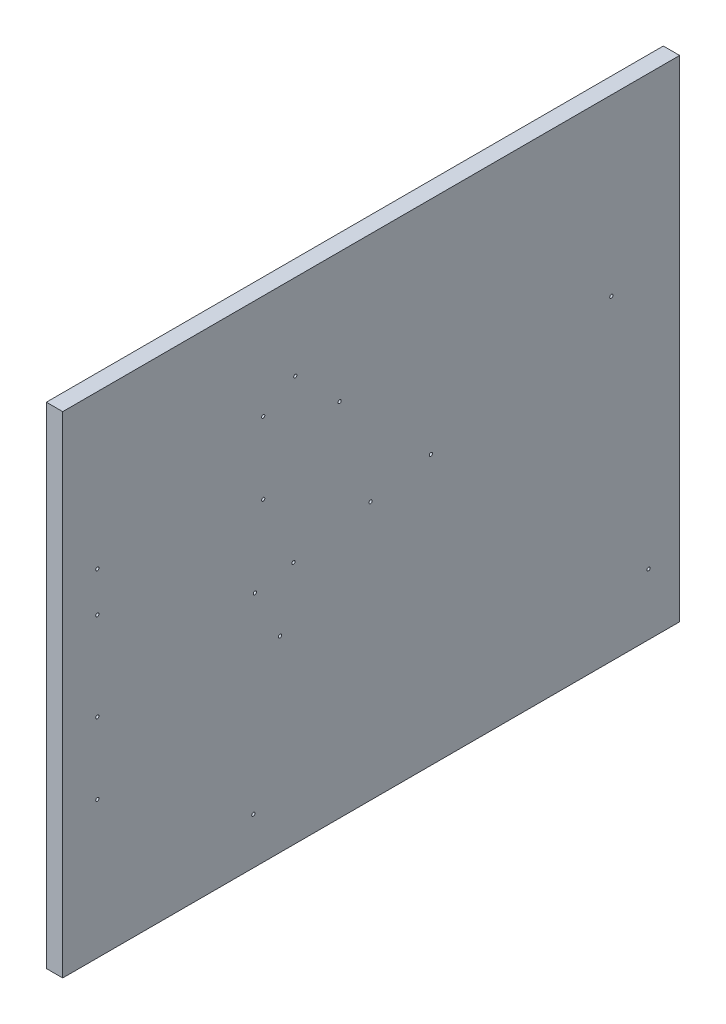
ISO-10303-21;
HEADER;
FILE_DESCRIPTION(('STEP AP214'),'2;1');
FILE_NAME('part.step','',(''),(''),'','','');
FILE_SCHEMA(('AUTOMOTIVE_DESIGN { 1 0 10303 214 1 1 1 1 }'));
ENDSEC;
DATA;
#1=APPLICATION_CONTEXT('core data for automotive mechanical design processes');
#2=APPLICATION_PROTOCOL_DEFINITION('international standard','automotive_design',2000,#1);
#3=PRODUCT_CONTEXT('',#1,'mechanical');
#4=PRODUCT('Part','Part','',(#3));
#5=PRODUCT_RELATED_PRODUCT_CATEGORY('part','',(#4));
#6=PRODUCT_DEFINITION_FORMATION('','',#4);
#7=PRODUCT_DEFINITION_CONTEXT('part definition',#1,'design');
#8=PRODUCT_DEFINITION('design','',#6,#7);
#9=PRODUCT_DEFINITION_SHAPE('','',#8);
#10=(LENGTH_UNIT() NAMED_UNIT(*) SI_UNIT(.MILLI.,.METRE.));
#11=(NAMED_UNIT(*) PLANE_ANGLE_UNIT() SI_UNIT($,.RADIAN.));
#12=(NAMED_UNIT(*) SI_UNIT($,.STERADIAN.) SOLID_ANGLE_UNIT());
#13=UNCERTAINTY_MEASURE_WITH_UNIT(LENGTH_MEASURE(1.E-05),#10,'distance_accuracy_value','');
#14=(GEOMETRIC_REPRESENTATION_CONTEXT(3) GLOBAL_UNCERTAINTY_ASSIGNED_CONTEXT((#13)) GLOBAL_UNIT_ASSIGNED_CONTEXT((#10,
#11,#12)) REPRESENTATION_CONTEXT('',''));
#15=CARTESIAN_POINT('',(0.,0.,0.));
#16=DIRECTION('',(0.,0.,1.));
#17=DIRECTION('',(1.,0.,0.));
#18=AXIS2_PLACEMENT_3D('',#15,#16,#17);
#19=CARTESIAN_POINT('',(15.,423.716182749274,74.5220709406169));
#20=DIRECTION('',(0.,0.,-1.));
#21=DIRECTION('',(0.,1.,0.));
#22=AXIS2_PLACEMENT_3D('',#19,#20,#21);
#23=PLANE('',#22);
#24=DIRECTION('',(0.,-1.,0.));
#25=VECTOR('',#24,1.);
#26=CARTESIAN_POINT('',(0.,423.716182749274,74.5220709406169));
#27=LINE('',#26,#25);
#28=CARTESIAN_POINT('',(0.,423.716182749274,74.5220709406169));
#29=VERTEX_POINT('',#28);
#30=CARTESIAN_POINT('',(0.,-26.2838172507259,74.5220709406169));
#31=VERTEX_POINT('',#30);
#32=EDGE_CURVE('E101',#29,#31,#27,.T.);
#33=ORIENTED_EDGE('',*,*,#32,.T.);
#34=DIRECTION('',(-1.,0.,0.));
#35=VECTOR('',#34,1.);
#36=CARTESIAN_POINT('',(15.,-26.2838172507259,74.5220709406169));
#37=LINE('',#36,#35);
#38=CARTESIAN_POINT('',(15.,-26.2838172507259,74.5220709406169));
#39=VERTEX_POINT('',#38);
#40=EDGE_CURVE('E11',#39,#31,#37,.T.);
#41=ORIENTED_EDGE('',*,*,#40,.F.);
#42=DIRECTION('',(0.,-1.,0.));
#43=VECTOR('',#42,1.);
#44=CARTESIAN_POINT('',(15.,423.716182749274,74.5220709406169));
#45=LINE('',#44,#43);
#46=CARTESIAN_POINT('',(15.,423.716182749274,74.5220709406169));
#47=VERTEX_POINT('',#46);
#48=EDGE_CURVE('E88',#47,#39,#45,.T.);
#49=ORIENTED_EDGE('',*,*,#48,.F.);
#50=DIRECTION('',(-1.,0.,0.));
#51=VECTOR('',#50,1.);
#52=CARTESIAN_POINT('',(15.,423.716182749274,74.5220709406169));
#53=LINE('',#52,#51);
#54=EDGE_CURVE('E97',#47,#29,#53,.T.);
#55=ORIENTED_EDGE('',*,*,#54,.T.);
#56=EDGE_LOOP('',(#33,#41,#49,#55));
#57=FACE_BOUND('',#56,.T.);
#58=ADVANCED_FACE('F35',(#57),#23,.F.);
#59=CARTESIAN_POINT('',(15.,-26.2838172507259,74.5220709406169));
#60=DIRECTION('',(0.,1.,0.));
#61=DIRECTION('',(0.,0.,1.));
#62=AXIS2_PLACEMENT_3D('',#59,#60,#61);
#63=PLANE('',#62);
#64=DIRECTION('',(0.,0.,-1.));
#65=VECTOR('',#64,1.);
#66=CARTESIAN_POINT('',(0.,-26.2838172507259,74.5220709406169));
#67=LINE('',#66,#65);
#68=CARTESIAN_POINT('',(0.,-26.2838172507287,-491.483230018847));
#69=VERTEX_POINT('',#68);
#70=EDGE_CURVE('E92',#31,#69,#67,.T.);
#71=ORIENTED_EDGE('',*,*,#70,.T.);
#72=DIRECTION('',(-1.,0.,0.));
#73=VECTOR('',#72,1.);
#74=CARTESIAN_POINT('',(15.,-26.2838172507287,-491.483230018847));
#75=LINE('',#74,#73);
#76=CARTESIAN_POINT('',(15.,-26.2838172507287,-491.483230018847));
#77=VERTEX_POINT('',#76);
#78=EDGE_CURVE('E44',#77,#69,#75,.T.);
#79=ORIENTED_EDGE('',*,*,#78,.F.);
#80=DIRECTION('',(0.,0.,-1.));
#81=VECTOR('',#80,1.);
#82=CARTESIAN_POINT('',(15.,-26.2838172507259,74.5220709406169));
#83=LINE('',#82,#81);
#84=EDGE_CURVE('E83',#39,#77,#83,.T.);
#85=ORIENTED_EDGE('',*,*,#84,.F.);
#86=ORIENTED_EDGE('',*,*,#40,.T.);
#87=EDGE_LOOP('',(#71,#79,#85,#86));
#88=FACE_BOUND('',#87,.T.);
#89=ADVANCED_FACE('F91',(#88),#63,.F.);
#90=CARTESIAN_POINT('',(15.,423.716182749271,-491.483230018847));
#91=DIRECTION('',(0.,0.,1.));
#92=DIRECTION('',(0.,-1.,0.));
#93=AXIS2_PLACEMENT_3D('',#90,#91,#92);
#94=PLANE('',#93);
#95=DIRECTION('',(0.,1.,0.));
#96=VECTOR('',#95,1.);
#97=CARTESIAN_POINT('',(0.,423.716182749271,-491.483230018847));
#98=LINE('',#97,#96);
#99=CARTESIAN_POINT('',(0.,423.716182749271,-491.483230018847));
#100=VERTEX_POINT('',#99);
#101=EDGE_CURVE('E70',#69,#100,#98,.T.);
#102=ORIENTED_EDGE('',*,*,#101,.T.);
#103=DIRECTION('',(-1.,0.,0.));
#104=VECTOR('',#103,1.);
#105=CARTESIAN_POINT('',(15.,423.716182749271,-491.483230018847));
#106=LINE('',#105,#104);
#107=CARTESIAN_POINT('',(15.,423.716182749271,-491.483230018847));
#108=VERTEX_POINT('',#107);
#109=EDGE_CURVE('E93',#108,#100,#106,.T.);
#110=ORIENTED_EDGE('',*,*,#109,.F.);
#111=DIRECTION('',(0.,1.,0.));
#112=VECTOR('',#111,1.);
#113=CARTESIAN_POINT('',(15.,423.716182749271,-491.483230018847));
#114=LINE('',#113,#112);
#115=EDGE_CURVE('E86',#77,#108,#114,.T.);
#116=ORIENTED_EDGE('',*,*,#115,.F.);
#117=ORIENTED_EDGE('',*,*,#78,.T.);
#118=EDGE_LOOP('',(#102,#110,#116,#117));
#119=FACE_BOUND('',#118,.T.);
#120=ADVANCED_FACE('F95',(#119),#94,.F.);
#121=CARTESIAN_POINT('',(15.,423.716182749274,74.5220709406169));
#122=DIRECTION('',(0.,-1.,0.));
#123=DIRECTION('',(0.,0.,-1.));
#124=AXIS2_PLACEMENT_3D('',#121,#122,#123);
#125=PLANE('',#124);
#126=DIRECTION('',(0.,0.,1.));
#127=VECTOR('',#126,1.);
#128=CARTESIAN_POINT('',(0.,423.716182749274,74.5220709406169));
#129=LINE('',#128,#127);
#130=EDGE_CURVE('E76',#100,#29,#129,.T.);
#131=ORIENTED_EDGE('',*,*,#130,.T.);
#132=ORIENTED_EDGE('',*,*,#54,.F.);
#133=DIRECTION('',(0.,0.,1.));
#134=VECTOR('',#133,1.);
#135=CARTESIAN_POINT('',(15.,423.716182749274,74.5220709406169));
#136=LINE('',#135,#134);
#137=EDGE_CURVE('E53',#108,#47,#136,.T.);
#138=ORIENTED_EDGE('',*,*,#137,.F.);
#139=ORIENTED_EDGE('',*,*,#109,.T.);
#140=EDGE_LOOP('',(#131,#132,#138,#139));
#141=FACE_BOUND('',#140,.T.);
#142=ADVANCED_FACE('F182',(#141),#125,.F.);
#143=CARTESIAN_POINT('',(15.,0.,0.));
#144=DIRECTION('',(1.,0.,0.));
#145=DIRECTION('',(0.,0.,-1.));
#146=AXIS2_PLACEMENT_3D('',#143,#144,#145);
#147=PLANE('',#146);
#148=CARTESIAN_POINT('',(15.,263.704028896328,-428.821301923143));
#149=DIRECTION('',(-1.,0.,0.));
#150=DIRECTION('',(0.,0.,1.));
#151=AXIS2_PLACEMENT_3D('',#148,#149,#150);
#152=CIRCLE('',#151,1.50000000000002);
#153=CARTESIAN_POINT('',(15.,263.704028896328,-427.321301923143));
#154=VERTEX_POINT('',#153);
#155=EDGE_CURVE('E404',#154,#154,#152,.T.);
#156=ORIENTED_EDGE('',*,*,#155,.T.);
#157=EDGE_LOOP('',(#156));
#158=FACE_BOUND('',#157,.T.);
#159=CARTESIAN_POINT('',(15.,262.061630052592,-109.444727656964));
#160=DIRECTION('',(-1.,0.,0.));
#161=DIRECTION('',(0.,0.,1.));
#162=AXIS2_PLACEMENT_3D('',#159,#160,#161);
#163=CIRCLE('',#162,1.5);
#164=CARTESIAN_POINT('',(15.,262.061630052592,-107.944727656964));
#165=VERTEX_POINT('',#164);
#166=EDGE_CURVE('E406',#165,#165,#163,.T.);
#167=ORIENTED_EDGE('',*,*,#166,.T.);
#168=EDGE_LOOP('',(#167));
#169=FACE_BOUND('',#168,.T.);
#170=CARTESIAN_POINT('',(15.,327.974766947683,-109.444727656964));
#171=DIRECTION('',(-1.,0.,0.));
#172=DIRECTION('',(0.,0.,1.));
#173=AXIS2_PLACEMENT_3D('',#170,#171,#172);
#174=CIRCLE('',#173,1.5);
#175=CARTESIAN_POINT('',(15.,327.974766947683,-107.944727656964));
#176=VERTEX_POINT('',#175);
#177=EDGE_CURVE('E412',#176,#176,#174,.T.);
#178=ORIENTED_EDGE('',*,*,#177,.T.);
#179=EDGE_LOOP('',(#178));
#180=FACE_BOUND('',#179,.T.);
#181=CARTESIAN_POINT('',(15.,29.9660510812131,-463.012887704361));
#182=DIRECTION('',(-1.,0.,0.));
#183=DIRECTION('',(0.,0.,1.));
#184=AXIS2_PLACEMENT_3D('',#181,#182,#183);
#185=CIRCLE('',#184,1.50000000000177);
#186=CARTESIAN_POINT('',(15.,29.9660510812131,-461.512887704359));
#187=VERTEX_POINT('',#186);
#188=EDGE_CURVE('E415',#187,#187,#185,.T.);
#189=ORIENTED_EDGE('',*,*,#188,.T.);
#190=EDGE_LOOP('',(#189));
#191=FACE_BOUND('',#190,.T.);
#192=CARTESIAN_POINT('',(15.,282.872517244577,42.7146520525029));
#193=DIRECTION('',(-1.,0.,0.));
#194=DIRECTION('',(0.,0.,1.));
#195=AXIS2_PLACEMENT_3D('',#192,#193,#194);
#196=CIRCLE('',#195,1.5);
#197=CARTESIAN_POINT('',(15.,282.872517244577,44.2146520525029));
#198=VERTEX_POINT('',#197);
#199=EDGE_CURVE('E405',#198,#198,#196,.T.);
#200=ORIENTED_EDGE('',*,*,#199,.T.);
#201=EDGE_LOOP('',(#200));
#202=FACE_BOUND('',#201,.T.);
#203=CARTESIAN_POINT('',(15.,246.301380308381,42.7146520525029));
#204=DIRECTION('',(-1.,0.,0.));
#205=DIRECTION('',(0.,0.,1.));
#206=AXIS2_PLACEMENT_3D('',#203,#204,#205);
#207=CIRCLE('',#206,1.5);
#208=CARTESIAN_POINT('',(15.,246.301380308381,44.2146520525029));
#209=VERTEX_POINT('',#208);
#210=EDGE_CURVE('E409',#209,#209,#207,.T.);
#211=ORIENTED_EDGE('',*,*,#210,.T.);
#212=EDGE_LOOP('',(#211));
#213=FACE_BOUND('',#212,.T.);
#214=CARTESIAN_POINT('',(15.,191.557326368785,-101.789718427287));
#215=DIRECTION('',(-1.,0.,0.));
#216=DIRECTION('',(0.,0.,1.));
#217=AXIS2_PLACEMENT_3D('',#214,#215,#216);
#218=CIRCLE('',#217,1.5);
#219=CARTESIAN_POINT('',(15.,191.557326368785,-100.289718427287));
#220=VERTEX_POINT('',#219);
#221=EDGE_CURVE('E440',#220,#220,#218,.T.);
#222=ORIENTED_EDGE('',*,*,#221,.T.);
#223=EDGE_LOOP('',(#222));
#224=FACE_BOUND('',#223,.T.);
#225=CARTESIAN_POINT('',(15.,16.3607927560594,-100.410954005248));
#226=DIRECTION('',(-1.,0.,0.));
#227=DIRECTION('',(0.,0.,1.));
#228=AXIS2_PLACEMENT_3D('',#225,#226,#227);
#229=CIRCLE('',#228,1.5);
#230=CARTESIAN_POINT('',(15.,16.3607927560594,-98.9109540052479));
#231=VERTEX_POINT('',#230);
#232=EDGE_CURVE('E436',#231,#231,#229,.T.);
#233=ORIENTED_EDGE('',*,*,#232,.T.);
#234=EDGE_LOOP('',(#233));
#235=FACE_BOUND('',#234,.T.);
#236=CARTESIAN_POINT('',(15.,99.6926212042853,42.7146520525029));
#237=DIRECTION('',(-1.,0.,0.));
#238=DIRECTION('',(0.,0.,1.));
#239=AXIS2_PLACEMENT_3D('',#236,#237,#238);
#240=CIRCLE('',#239,1.5);
#241=CARTESIAN_POINT('',(15.,99.6926212042853,44.2146520525029));
#242=VERTEX_POINT('',#241);
#243=EDGE_CURVE('E167',#242,#242,#240,.T.);
#244=ORIENTED_EDGE('',*,*,#243,.T.);
#245=EDGE_LOOP('',(#244));
#246=FACE_BOUND('',#245,.T.);
#247=CARTESIAN_POINT('',(15.,145.715565594254,-124.831154963935));
#248=DIRECTION('',(-1.,0.,0.));
#249=DIRECTION('',(0.,0.,1.));
#250=AXIS2_PLACEMENT_3D('',#247,#248,#249);
#251=CIRCLE('',#250,1.5);
#252=CARTESIAN_POINT('',(15.,145.715565594254,-123.331154963935));
#253=VERTEX_POINT('',#252);
#254=EDGE_CURVE('E431',#253,#253,#251,.T.);
#255=ORIENTED_EDGE('',*,*,#254,.T.);
#256=EDGE_LOOP('',(#255));
#257=FACE_BOUND('',#256,.T.);
#258=CARTESIAN_POINT('',(15.,165.278795224128,42.7146520525029));
#259=DIRECTION('',(-1.,0.,0.));
#260=DIRECTION('',(0.,0.,1.));
#261=AXIS2_PLACEMENT_3D('',#258,#259,#260);
#262=CIRCLE('',#261,1.5);
#263=CARTESIAN_POINT('',(15.,165.278795224128,44.2146520525029));
#264=VERTEX_POINT('',#263);
#265=EDGE_CURVE('E429',#264,#264,#262,.T.);
#266=ORIENTED_EDGE('',*,*,#265,.T.);
#267=EDGE_LOOP('',(#266));
#268=FACE_BOUND('',#267,.T.);
#269=CARTESIAN_POINT('',(15.,197.982216734422,-137.119879484511));
#270=DIRECTION('',(-1.,0.,0.));
#271=DIRECTION('',(0.,0.,1.));
#272=AXIS2_PLACEMENT_3D('',#269,#270,#271);
#273=CIRCLE('',#272,1.5);
#274=CARTESIAN_POINT('',(15.,197.982216734422,-135.619879484511));
#275=VERTEX_POINT('',#274);
#276=EDGE_CURVE('E426',#275,#275,#273,.T.);
#277=ORIENTED_EDGE('',*,*,#276,.T.);
#278=EDGE_LOOP('',(#277));
#279=FACE_BOUND('',#278,.T.);
#280=CARTESIAN_POINT('',(15.,210.859443584632,-207.931126478173));
#281=DIRECTION('',(-1.,0.,0.));
#282=DIRECTION('',(0.,0.,1.));
#283=AXIS2_PLACEMENT_3D('',#280,#281,#282);
#284=CIRCLE('',#283,1.5);
#285=CARTESIAN_POINT('',(15.,210.859443584632,-206.431126478173));
#286=VERTEX_POINT('',#285);
#287=EDGE_CURVE('E423',#286,#286,#284,.T.);
#288=ORIENTED_EDGE('',*,*,#287,.T.);
#289=EDGE_LOOP('',(#288));
#290=FACE_BOUND('',#289,.T.);
#291=CARTESIAN_POINT('',(15.,220.869392182557,-263.276124199719));
#292=DIRECTION('',(-1.,0.,0.));
#293=DIRECTION('',(0.,0.,1.));
#294=AXIS2_PLACEMENT_3D('',#291,#292,#293);
#295=CIRCLE('',#294,1.49999999998557);
#296=CARTESIAN_POINT('',(15.,220.869392182557,-261.776124199733));
#297=VERTEX_POINT('',#296);
#298=EDGE_CURVE('E420',#297,#297,#295,.T.);
#299=ORIENTED_EDGE('',*,*,#298,.T.);
#300=EDGE_LOOP('',(#299));
#301=FACE_BOUND('',#300,.T.);
#302=CARTESIAN_POINT('',(15.,304.649886729785,-179.495629652479));
#303=DIRECTION('',(-1.,0.,0.));
#304=DIRECTION('',(0.,0.,1.));
#305=AXIS2_PLACEMENT_3D('',#302,#303,#304);
#306=CIRCLE('',#305,1.49999999999977);
#307=CARTESIAN_POINT('',(15.,304.649886729785,-177.995629652479));
#308=VERTEX_POINT('',#307);
#309=EDGE_CURVE('E119',#308,#308,#306,.T.);
#310=ORIENTED_EDGE('',*,*,#309,.T.);
#311=EDGE_LOOP('',(#310));
#312=FACE_BOUND('',#311,.T.);
#313=CARTESIAN_POINT('',(15.,345.23563332764,-138.909883054618));
#314=DIRECTION('',(-1.,0.,0.));
#315=DIRECTION('',(0.,0.,1.));
#316=AXIS2_PLACEMENT_3D('',#313,#314,#315);
#317=CIRCLE('',#316,1.49999999999983);
#318=CARTESIAN_POINT('',(15.,345.23563332764,-137.409883054618));
#319=VERTEX_POINT('',#318);
#320=EDGE_CURVE('E114',#319,#319,#317,.T.);
#321=ORIENTED_EDGE('',*,*,#320,.T.);
#322=EDGE_LOOP('',(#321));
#323=FACE_BOUND('',#322,.T.);
#324=ORIENTED_EDGE('',*,*,#48,.T.);
#325=ORIENTED_EDGE('',*,*,#84,.T.);
#326=ORIENTED_EDGE('',*,*,#115,.T.);
#327=ORIENTED_EDGE('',*,*,#137,.T.);
#328=EDGE_LOOP('',(#324,#325,#326,#327));
#329=FACE_BOUND('',#328,.T.);
#330=ADVANCED_FACE('F84',(#158,#169,#180,#191,#202,#213,#224,#235,#246,#257,#268,#279,#290,#301,
#312,#323,#329),#147,.T.);
#331=CARTESIAN_POINT('',(0.,0.,0.));
#332=DIRECTION('',(1.,0.,0.));
#333=DIRECTION('',(0.,0.,-1.));
#334=AXIS2_PLACEMENT_3D('',#331,#332,#333);
#335=PLANE('',#334);
#336=CARTESIAN_POINT('',(0.,263.704028896328,-428.821301923143));
#337=DIRECTION('',(1.,0.,0.));
#338=DIRECTION('',(0.,0.,-1.));
#339=AXIS2_PLACEMENT_3D('',#336,#337,#338);
#340=CIRCLE('',#339,1.50000000000002);
#341=CARTESIAN_POINT('',(0.,263.704028896328,-430.321301923143));
#342=VERTEX_POINT('',#341);
#343=EDGE_CURVE('E38',#342,#342,#340,.T.);
#344=ORIENTED_EDGE('',*,*,#343,.T.);
#345=EDGE_LOOP('',(#344));
#346=FACE_BOUND('',#345,.T.);
#347=CARTESIAN_POINT('',(0.,262.061630052592,-109.444727656964));
#348=DIRECTION('',(1.,0.,0.));
#349=DIRECTION('',(0.,0.,-1.));
#350=AXIS2_PLACEMENT_3D('',#347,#348,#349);
#351=CIRCLE('',#350,1.5);
#352=CARTESIAN_POINT('',(0.,262.061630052592,-110.944727656964));
#353=VERTEX_POINT('',#352);
#354=EDGE_CURVE('E154',#353,#353,#351,.T.);
#355=ORIENTED_EDGE('',*,*,#354,.T.);
#356=EDGE_LOOP('',(#355));
#357=FACE_BOUND('',#356,.T.);
#358=CARTESIAN_POINT('',(0.,327.974766947683,-109.444727656964));
#359=DIRECTION('',(1.,0.,0.));
#360=DIRECTION('',(0.,0.,-1.));
#361=AXIS2_PLACEMENT_3D('',#358,#359,#360);
#362=CIRCLE('',#361,1.5);
#363=CARTESIAN_POINT('',(0.,327.974766947683,-110.944727656964));
#364=VERTEX_POINT('',#363);
#365=EDGE_CURVE('E152',#364,#364,#362,.T.);
#366=ORIENTED_EDGE('',*,*,#365,.T.);
#367=EDGE_LOOP('',(#366));
#368=FACE_BOUND('',#367,.T.);
#369=CARTESIAN_POINT('',(0.,29.9660510812131,-463.012887704361));
#370=DIRECTION('',(1.,0.,0.));
#371=DIRECTION('',(0.,0.,-1.));
#372=AXIS2_PLACEMENT_3D('',#369,#370,#371);
#373=CIRCLE('',#372,1.50000000000177);
#374=CARTESIAN_POINT('',(0.,29.9660510812131,-464.512887704363));
#375=VERTEX_POINT('',#374);
#376=EDGE_CURVE('E149',#375,#375,#373,.T.);
#377=ORIENTED_EDGE('',*,*,#376,.T.);
#378=EDGE_LOOP('',(#377));
#379=FACE_BOUND('',#378,.T.);
#380=CARTESIAN_POINT('',(0.,282.872517244577,42.7146520525029));
#381=DIRECTION('',(1.,0.,0.));
#382=DIRECTION('',(0.,0.,-1.));
#383=AXIS2_PLACEMENT_3D('',#380,#381,#382);
#384=CIRCLE('',#383,1.5);
#385=CARTESIAN_POINT('',(0.,282.872517244577,41.2146520525029));
#386=VERTEX_POINT('',#385);
#387=EDGE_CURVE('E146',#386,#386,#384,.T.);
#388=ORIENTED_EDGE('',*,*,#387,.T.);
#389=EDGE_LOOP('',(#388));
#390=FACE_BOUND('',#389,.T.);
#391=CARTESIAN_POINT('',(0.,246.301380308381,42.7146520525029));
#392=DIRECTION('',(1.,0.,0.));
#393=DIRECTION('',(0.,0.,-1.));
#394=AXIS2_PLACEMENT_3D('',#391,#392,#393);
#395=CIRCLE('',#394,1.5);
#396=CARTESIAN_POINT('',(0.,246.301380308381,41.2146520525029));
#397=VERTEX_POINT('',#396);
#398=EDGE_CURVE('E143',#397,#397,#395,.T.);
#399=ORIENTED_EDGE('',*,*,#398,.T.);
#400=EDGE_LOOP('',(#399));
#401=FACE_BOUND('',#400,.T.);
#402=CARTESIAN_POINT('',(0.,191.557326368785,-101.789718427287));
#403=DIRECTION('',(1.,0.,0.));
#404=DIRECTION('',(0.,0.,-1.));
#405=AXIS2_PLACEMENT_3D('',#402,#403,#404);
#406=CIRCLE('',#405,1.5);
#407=CARTESIAN_POINT('',(0.,191.557326368785,-103.289718427287));
#408=VERTEX_POINT('',#407);
#409=EDGE_CURVE('E140',#408,#408,#406,.T.);
#410=ORIENTED_EDGE('',*,*,#409,.T.);
#411=EDGE_LOOP('',(#410));
#412=FACE_BOUND('',#411,.T.);
#413=CARTESIAN_POINT('',(0.,16.3607927560594,-100.410954005248));
#414=DIRECTION('',(1.,0.,0.));
#415=DIRECTION('',(0.,0.,-1.));
#416=AXIS2_PLACEMENT_3D('',#413,#414,#415);
#417=CIRCLE('',#416,1.5);
#418=CARTESIAN_POINT('',(0.,16.3607927560594,-101.910954005248));
#419=VERTEX_POINT('',#418);
#420=EDGE_CURVE('E137',#419,#419,#417,.T.);
#421=ORIENTED_EDGE('',*,*,#420,.T.);
#422=EDGE_LOOP('',(#421));
#423=FACE_BOUND('',#422,.T.);
#424=CARTESIAN_POINT('',(0.,99.6926212042853,42.7146520525029));
#425=DIRECTION('',(1.,0.,0.));
#426=DIRECTION('',(0.,0.,-1.));
#427=AXIS2_PLACEMENT_3D('',#424,#425,#426);
#428=CIRCLE('',#427,1.5);
#429=CARTESIAN_POINT('',(0.,99.6926212042853,41.2146520525029));
#430=VERTEX_POINT('',#429);
#431=EDGE_CURVE('E134',#430,#430,#428,.T.);
#432=ORIENTED_EDGE('',*,*,#431,.T.);
#433=EDGE_LOOP('',(#432));
#434=FACE_BOUND('',#433,.T.);
#435=CARTESIAN_POINT('',(0.,145.715565594254,-124.831154963935));
#436=DIRECTION('',(1.,0.,0.));
#437=DIRECTION('',(0.,0.,-1.));
#438=AXIS2_PLACEMENT_3D('',#435,#436,#437);
#439=CIRCLE('',#438,1.5);
#440=CARTESIAN_POINT('',(0.,145.715565594254,-126.331154963935));
#441=VERTEX_POINT('',#440);
#442=EDGE_CURVE('E131',#441,#441,#439,.T.);
#443=ORIENTED_EDGE('',*,*,#442,.T.);
#444=EDGE_LOOP('',(#443));
#445=FACE_BOUND('',#444,.T.);
#446=CARTESIAN_POINT('',(0.,165.278795224128,42.7146520525029));
#447=DIRECTION('',(1.,0.,0.));
#448=DIRECTION('',(0.,0.,-1.));
#449=AXIS2_PLACEMENT_3D('',#446,#447,#448);
#450=CIRCLE('',#449,1.5);
#451=CARTESIAN_POINT('',(0.,165.278795224128,41.2146520525029));
#452=VERTEX_POINT('',#451);
#453=EDGE_CURVE('E128',#452,#452,#450,.T.);
#454=ORIENTED_EDGE('',*,*,#453,.T.);
#455=EDGE_LOOP('',(#454));
#456=FACE_BOUND('',#455,.T.);
#457=CARTESIAN_POINT('',(0.,197.982216734422,-137.119879484511));
#458=DIRECTION('',(1.,0.,0.));
#459=DIRECTION('',(0.,0.,-1.));
#460=AXIS2_PLACEMENT_3D('',#457,#458,#459);
#461=CIRCLE('',#460,1.5);
#462=CARTESIAN_POINT('',(0.,197.982216734422,-138.619879484511));
#463=VERTEX_POINT('',#462);
#464=EDGE_CURVE('E125',#463,#463,#461,.T.);
#465=ORIENTED_EDGE('',*,*,#464,.T.);
#466=EDGE_LOOP('',(#465));
#467=FACE_BOUND('',#466,.T.);
#468=CARTESIAN_POINT('',(0.,210.859443584632,-207.931126478173));
#469=DIRECTION('',(1.,0.,0.));
#470=DIRECTION('',(0.,0.,-1.));
#471=AXIS2_PLACEMENT_3D('',#468,#469,#470);
#472=CIRCLE('',#471,1.5);
#473=CARTESIAN_POINT('',(0.,210.859443584632,-209.431126478173));
#474=VERTEX_POINT('',#473);
#475=EDGE_CURVE('E122',#474,#474,#472,.T.);
#476=ORIENTED_EDGE('',*,*,#475,.T.);
#477=EDGE_LOOP('',(#476));
#478=FACE_BOUND('',#477,.T.);
#479=CARTESIAN_POINT('',(0.,220.869392182557,-263.276124199719));
#480=DIRECTION('',(1.,0.,0.));
#481=DIRECTION('',(0.,0.,-1.));
#482=AXIS2_PLACEMENT_3D('',#479,#480,#481);
#483=CIRCLE('',#482,1.49999999998557);
#484=CARTESIAN_POINT('',(0.,220.869392182557,-264.776124199704));
#485=VERTEX_POINT('',#484);
#486=EDGE_CURVE('E118',#485,#485,#483,.T.);
#487=ORIENTED_EDGE('',*,*,#486,.T.);
#488=EDGE_LOOP('',(#487));
#489=FACE_BOUND('',#488,.T.);
#490=CARTESIAN_POINT('',(0.,304.649886729785,-179.495629652479));
#491=DIRECTION('',(1.,0.,0.));
#492=DIRECTION('',(0.,0.,-1.));
#493=AXIS2_PLACEMENT_3D('',#490,#491,#492);
#494=CIRCLE('',#493,1.49999999999977);
#495=CARTESIAN_POINT('',(0.,304.649886729785,-180.995629652478));
#496=VERTEX_POINT('',#495);
#497=EDGE_CURVE('E115',#496,#496,#494,.T.);
#498=ORIENTED_EDGE('',*,*,#497,.T.);
#499=EDGE_LOOP('',(#498));
#500=FACE_BOUND('',#499,.T.);
#501=CARTESIAN_POINT('',(0.,345.23563332764,-138.909883054618));
#502=DIRECTION('',(1.,0.,0.));
#503=DIRECTION('',(0.,0.,-1.));
#504=AXIS2_PLACEMENT_3D('',#501,#502,#503);
#505=CIRCLE('',#504,1.49999999999983);
#506=CARTESIAN_POINT('',(0.,345.23563332764,-140.409883054617));
#507=VERTEX_POINT('',#506);
#508=EDGE_CURVE('E110',#507,#507,#505,.T.);
#509=ORIENTED_EDGE('',*,*,#508,.T.);
#510=EDGE_LOOP('',(#509));
#511=FACE_BOUND('',#510,.T.);
#512=CARTESIAN_POINT('',(0.,408.987044781483,-459.121136886836));
#513=DIRECTION('',(-1.,0.,0.));
#514=DIRECTION('',(0.,0.,1.));
#515=AXIS2_PLACEMENT_3D('',#512,#513,#514);
#516=CIRCLE('',#515,3.99999999999999);
#517=CARTESIAN_POINT('',(0.,408.987044781483,-455.121136886836));
#518=VERTEX_POINT('',#517);
#519=EDGE_CURVE('E113',#518,#518,#516,.T.);
#520=ORIENTED_EDGE('',*,*,#519,.F.);
#521=EDGE_LOOP('',(#520));
#522=FACE_BOUND('',#521,.T.);
#523=ORIENTED_EDGE('',*,*,#32,.F.);
#524=ORIENTED_EDGE('',*,*,#130,.F.);
#525=ORIENTED_EDGE('',*,*,#101,.F.);
#526=ORIENTED_EDGE('',*,*,#70,.F.);
#527=EDGE_LOOP('',(#523,#524,#525,#526));
#528=FACE_BOUND('',#527,.T.);
#529=ADVANCED_FACE('F176',(#346,#357,#368,#379,#390,#401,#412,#423,#434,#445,#456,#467,#478,
#489,#500,#511,#522,#528),#335,.F.);
#530=CARTESIAN_POINT('',(10.,408.987044781483,-459.121136886836));
#531=DIRECTION('',(-1.,0.,0.));
#532=DIRECTION('',(0.,0.,1.));
#533=AXIS2_PLACEMENT_3D('',#530,#531,#532);
#534=CYLINDRICAL_SURFACE('',#533,3.99999999999999);
#535=CARTESIAN_POINT('',(10.,408.987044781483,-459.121136886836));
#536=DIRECTION('',(-1.,0.,0.));
#537=DIRECTION('',(0.,0.,1.));
#538=AXIS2_PLACEMENT_3D('',#535,#536,#537);
#539=CIRCLE('',#538,3.99999999999999);
#540=CARTESIAN_POINT('',(10.,408.987044781483,-455.121136886836));
#541=VERTEX_POINT('',#540);
#542=EDGE_CURVE('E104',#541,#541,#539,.T.);
#543=ORIENTED_EDGE('',*,*,#542,.F.);
#544=EDGE_LOOP('',(#543));
#545=FACE_BOUND('',#544,.T.);
#546=ORIENTED_EDGE('',*,*,#519,.T.);
#547=EDGE_LOOP('',(#546));
#548=FACE_BOUND('',#547,.T.);
#549=ADVANCED_FACE('F174',(#545,#548),#534,.F.);
#550=CARTESIAN_POINT('',(10.,408.987044781483,-459.121136886836));
#551=DIRECTION('',(-1.,0.,0.));
#552=DIRECTION('',(0.,0.,1.));
#553=AXIS2_PLACEMENT_3D('',#550,#551,#552);
#554=PLANE('',#553);
#555=ORIENTED_EDGE('',*,*,#542,.T.);
#556=EDGE_LOOP('',(#555));
#557=FACE_BOUND('',#556,.T.);
#558=ADVANCED_FACE('F216',(#557),#554,.T.);
#559=CARTESIAN_POINT('',(15.,345.23563332764,-138.909883054618));
#560=DIRECTION('',(-1.,0.,0.));
#561=DIRECTION('',(0.,0.,1.));
#562=AXIS2_PLACEMENT_3D('',#559,#560,#561);
#563=CYLINDRICAL_SURFACE('',#562,1.49999999999983);
#564=ORIENTED_EDGE('',*,*,#320,.F.);
#565=EDGE_LOOP('',(#564));
#566=FACE_BOUND('',#565,.T.);
#567=ORIENTED_EDGE('',*,*,#508,.F.);
#568=EDGE_LOOP('',(#567));
#569=FACE_BOUND('',#568,.T.);
#570=ADVANCED_FACE('F227',(#566,#569),#563,.F.);
#571=CARTESIAN_POINT('',(15.,304.649886729785,-179.495629652479));
#572=DIRECTION('',(-1.,0.,0.));
#573=DIRECTION('',(0.,0.,1.));
#574=AXIS2_PLACEMENT_3D('',#571,#572,#573);
#575=CYLINDRICAL_SURFACE('',#574,1.49999999999977);
#576=ORIENTED_EDGE('',*,*,#309,.F.);
#577=EDGE_LOOP('',(#576));
#578=FACE_BOUND('',#577,.T.);
#579=ORIENTED_EDGE('',*,*,#497,.F.);
#580=EDGE_LOOP('',(#579));
#581=FACE_BOUND('',#580,.T.);
#582=ADVANCED_FACE('F247',(#578,#581),#575,.F.);
#583=CARTESIAN_POINT('',(15.,220.869392182557,-263.276124199719));
#584=DIRECTION('',(-1.,0.,0.));
#585=DIRECTION('',(0.,0.,1.));
#586=AXIS2_PLACEMENT_3D('',#583,#584,#585);
#587=CYLINDRICAL_SURFACE('',#586,1.49999999998557);
#588=ORIENTED_EDGE('',*,*,#298,.F.);
#589=EDGE_LOOP('',(#588));
#590=FACE_BOUND('',#589,.T.);
#591=ORIENTED_EDGE('',*,*,#486,.F.);
#592=EDGE_LOOP('',(#591));
#593=FACE_BOUND('',#592,.T.);
#594=ADVANCED_FACE('F257',(#590,#593),#587,.F.);
#595=CARTESIAN_POINT('',(15.,210.859443584632,-207.931126478173));
#596=DIRECTION('',(-1.,0.,0.));
#597=DIRECTION('',(0.,0.,1.));
#598=AXIS2_PLACEMENT_3D('',#595,#596,#597);
#599=CYLINDRICAL_SURFACE('',#598,1.5);
#600=ORIENTED_EDGE('',*,*,#287,.F.);
#601=EDGE_LOOP('',(#600));
#602=FACE_BOUND('',#601,.T.);
#603=ORIENTED_EDGE('',*,*,#475,.F.);
#604=EDGE_LOOP('',(#603));
#605=FACE_BOUND('',#604,.T.);
#606=ADVANCED_FACE('F267',(#602,#605),#599,.F.);
#607=CARTESIAN_POINT('',(15.,197.982216734422,-137.119879484511));
#608=DIRECTION('',(-1.,0.,0.));
#609=DIRECTION('',(0.,0.,1.));
#610=AXIS2_PLACEMENT_3D('',#607,#608,#609);
#611=CYLINDRICAL_SURFACE('',#610,1.5);
#612=ORIENTED_EDGE('',*,*,#276,.F.);
#613=EDGE_LOOP('',(#612));
#614=FACE_BOUND('',#613,.T.);
#615=ORIENTED_EDGE('',*,*,#464,.F.);
#616=EDGE_LOOP('',(#615));
#617=FACE_BOUND('',#616,.T.);
#618=ADVANCED_FACE('F277',(#614,#617),#611,.F.);
#619=CARTESIAN_POINT('',(15.,165.278795224128,42.7146520525029));
#620=DIRECTION('',(-1.,0.,0.));
#621=DIRECTION('',(0.,0.,1.));
#622=AXIS2_PLACEMENT_3D('',#619,#620,#621);
#623=CYLINDRICAL_SURFACE('',#622,1.5);
#624=ORIENTED_EDGE('',*,*,#265,.F.);
#625=EDGE_LOOP('',(#624));
#626=FACE_BOUND('',#625,.T.);
#627=ORIENTED_EDGE('',*,*,#453,.F.);
#628=EDGE_LOOP('',(#627));
#629=FACE_BOUND('',#628,.T.);
#630=ADVANCED_FACE('F287',(#626,#629),#623,.F.);
#631=CARTESIAN_POINT('',(15.,145.715565594254,-124.831154963935));
#632=DIRECTION('',(-1.,0.,0.));
#633=DIRECTION('',(0.,0.,1.));
#634=AXIS2_PLACEMENT_3D('',#631,#632,#633);
#635=CYLINDRICAL_SURFACE('',#634,1.5);
#636=ORIENTED_EDGE('',*,*,#254,.F.);
#637=EDGE_LOOP('',(#636));
#638=FACE_BOUND('',#637,.T.);
#639=ORIENTED_EDGE('',*,*,#442,.F.);
#640=EDGE_LOOP('',(#639));
#641=FACE_BOUND('',#640,.T.);
#642=ADVANCED_FACE('F297',(#638,#641),#635,.F.);
#643=CARTESIAN_POINT('',(15.,99.6926212042853,42.7146520525029));
#644=DIRECTION('',(-1.,0.,0.));
#645=DIRECTION('',(0.,0.,1.));
#646=AXIS2_PLACEMENT_3D('',#643,#644,#645);
#647=CYLINDRICAL_SURFACE('',#646,1.5);
#648=ORIENTED_EDGE('',*,*,#243,.F.);
#649=EDGE_LOOP('',(#648));
#650=FACE_BOUND('',#649,.T.);
#651=ORIENTED_EDGE('',*,*,#431,.F.);
#652=EDGE_LOOP('',(#651));
#653=FACE_BOUND('',#652,.T.);
#654=ADVANCED_FACE('F307',(#650,#653),#647,.F.);
#655=CARTESIAN_POINT('',(15.,16.3607927560594,-100.410954005248));
#656=DIRECTION('',(-1.,0.,0.));
#657=DIRECTION('',(0.,0.,1.));
#658=AXIS2_PLACEMENT_3D('',#655,#656,#657);
#659=CYLINDRICAL_SURFACE('',#658,1.5);
#660=ORIENTED_EDGE('',*,*,#232,.F.);
#661=EDGE_LOOP('',(#660));
#662=FACE_BOUND('',#661,.T.);
#663=ORIENTED_EDGE('',*,*,#420,.F.);
#664=EDGE_LOOP('',(#663));
#665=FACE_BOUND('',#664,.T.);
#666=ADVANCED_FACE('F317',(#662,#665),#659,.F.);
#667=CARTESIAN_POINT('',(15.,191.557326368785,-101.789718427287));
#668=DIRECTION('',(-1.,0.,0.));
#669=DIRECTION('',(0.,0.,1.));
#670=AXIS2_PLACEMENT_3D('',#667,#668,#669);
#671=CYLINDRICAL_SURFACE('',#670,1.5);
#672=ORIENTED_EDGE('',*,*,#221,.F.);
#673=EDGE_LOOP('',(#672));
#674=FACE_BOUND('',#673,.T.);
#675=ORIENTED_EDGE('',*,*,#409,.F.);
#676=EDGE_LOOP('',(#675));
#677=FACE_BOUND('',#676,.T.);
#678=ADVANCED_FACE('F327',(#674,#677),#671,.F.);
#679=CARTESIAN_POINT('',(15.,246.301380308381,42.7146520525029));
#680=DIRECTION('',(-1.,0.,0.));
#681=DIRECTION('',(0.,0.,1.));
#682=AXIS2_PLACEMENT_3D('',#679,#680,#681);
#683=CYLINDRICAL_SURFACE('',#682,1.5);
#684=ORIENTED_EDGE('',*,*,#210,.F.);
#685=EDGE_LOOP('',(#684));
#686=FACE_BOUND('',#685,.T.);
#687=ORIENTED_EDGE('',*,*,#398,.F.);
#688=EDGE_LOOP('',(#687));
#689=FACE_BOUND('',#688,.T.);
#690=ADVANCED_FACE('F337',(#686,#689),#683,.F.);
#691=CARTESIAN_POINT('',(15.,282.872517244577,42.7146520525029));
#692=DIRECTION('',(-1.,0.,0.));
#693=DIRECTION('',(0.,0.,1.));
#694=AXIS2_PLACEMENT_3D('',#691,#692,#693);
#695=CYLINDRICAL_SURFACE('',#694,1.5);
#696=ORIENTED_EDGE('',*,*,#199,.F.);
#697=EDGE_LOOP('',(#696));
#698=FACE_BOUND('',#697,.T.);
#699=ORIENTED_EDGE('',*,*,#387,.F.);
#700=EDGE_LOOP('',(#699));
#701=FACE_BOUND('',#700,.T.);
#702=ADVANCED_FACE('F347',(#698,#701),#695,.F.);
#703=CARTESIAN_POINT('',(15.,29.9660510812131,-463.012887704361));
#704=DIRECTION('',(-1.,0.,0.));
#705=DIRECTION('',(0.,0.,1.));
#706=AXIS2_PLACEMENT_3D('',#703,#704,#705);
#707=CYLINDRICAL_SURFACE('',#706,1.50000000000177);
#708=ORIENTED_EDGE('',*,*,#188,.F.);
#709=EDGE_LOOP('',(#708));
#710=FACE_BOUND('',#709,.T.);
#711=ORIENTED_EDGE('',*,*,#376,.F.);
#712=EDGE_LOOP('',(#711));
#713=FACE_BOUND('',#712,.T.);
#714=ADVANCED_FACE('F357',(#710,#713),#707,.F.);
#715=CARTESIAN_POINT('',(15.,327.974766947683,-109.444727656964));
#716=DIRECTION('',(-1.,0.,0.));
#717=DIRECTION('',(0.,0.,1.));
#718=AXIS2_PLACEMENT_3D('',#715,#716,#717);
#719=CYLINDRICAL_SURFACE('',#718,1.5);
#720=ORIENTED_EDGE('',*,*,#177,.F.);
#721=EDGE_LOOP('',(#720));
#722=FACE_BOUND('',#721,.T.);
#723=ORIENTED_EDGE('',*,*,#365,.F.);
#724=EDGE_LOOP('',(#723));
#725=FACE_BOUND('',#724,.T.);
#726=ADVANCED_FACE('F367',(#722,#725),#719,.F.);
#727=CARTESIAN_POINT('',(15.,262.061630052592,-109.444727656964));
#728=DIRECTION('',(-1.,0.,0.));
#729=DIRECTION('',(0.,0.,1.));
#730=AXIS2_PLACEMENT_3D('',#727,#728,#729);
#731=CYLINDRICAL_SURFACE('',#730,1.5);
#732=ORIENTED_EDGE('',*,*,#166,.F.);
#733=EDGE_LOOP('',(#732));
#734=FACE_BOUND('',#733,.T.);
#735=ORIENTED_EDGE('',*,*,#354,.F.);
#736=EDGE_LOOP('',(#735));
#737=FACE_BOUND('',#736,.T.);
#738=ADVANCED_FACE('F377',(#734,#737),#731,.F.);
#739=CARTESIAN_POINT('',(15.,263.704028896328,-428.821301923143));
#740=DIRECTION('',(-1.,0.,0.));
#741=DIRECTION('',(0.,0.,1.));
#742=AXIS2_PLACEMENT_3D('',#739,#740,#741);
#743=CYLINDRICAL_SURFACE('',#742,1.50000000000002);
#744=ORIENTED_EDGE('',*,*,#155,.F.);
#745=EDGE_LOOP('',(#744));
#746=FACE_BOUND('',#745,.T.);
#747=ORIENTED_EDGE('',*,*,#343,.F.);
#748=EDGE_LOOP('',(#747));
#749=FACE_BOUND('',#748,.T.);
#750=ADVANCED_FACE('F387',(#746,#749),#743,.F.);
#751=CLOSED_SHELL('',(#58,#89,#120,#142,#330,#529,#549,#558,#570,#582,#594,#606,#618,#630,#642,
#654,#666,#678,#690,#702,#714,#726,#738,#750));
#752=MANIFOLD_SOLID_BREP('B2',#751);
#753=ADVANCED_BREP_SHAPE_REPRESENTATION('',(#18,#752),#14);
#754=SHAPE_DEFINITION_REPRESENTATION(#9,#753);
ENDSEC;
END-ISO-10303-21;
